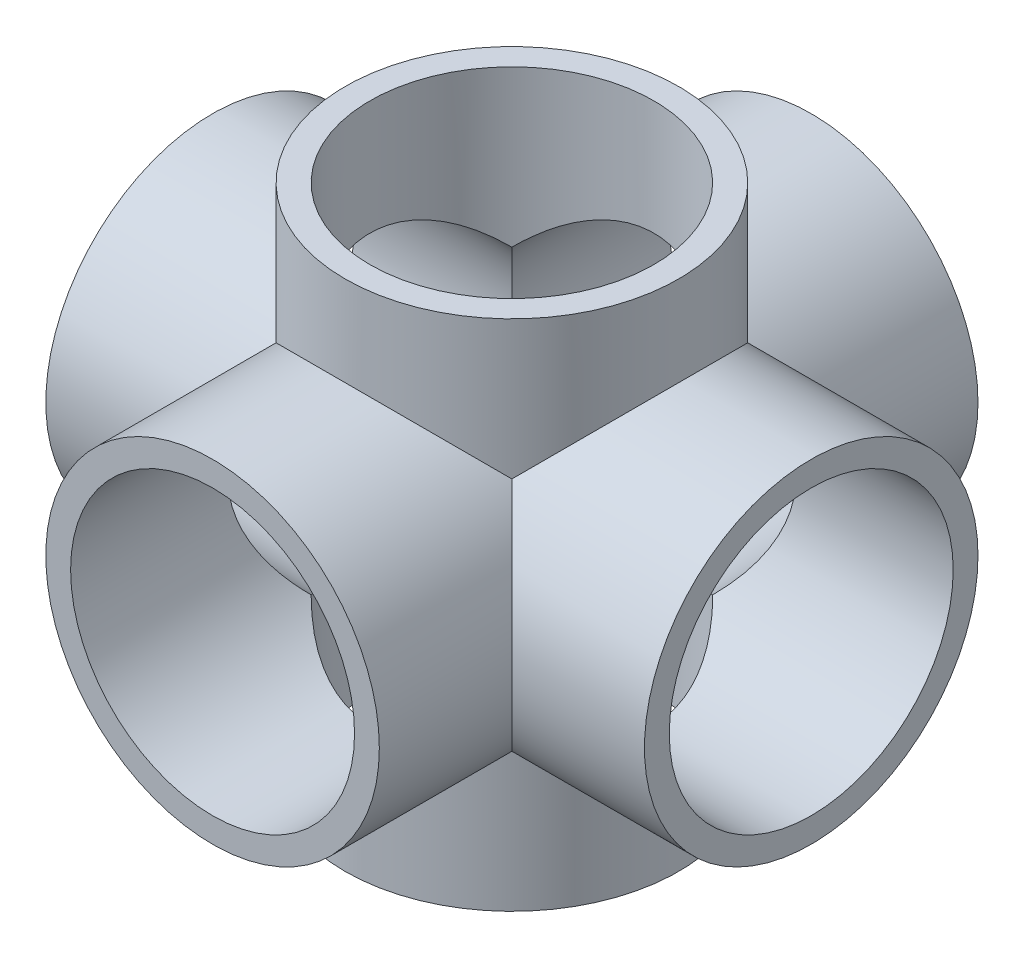
ISO-10303-21;
HEADER;
FILE_DESCRIPTION(('STEP AP214'),'2;1');
FILE_NAME('part.step','',(''),(''),'','','');
FILE_SCHEMA(('AUTOMOTIVE_DESIGN { 1 0 10303 214 1 1 1 1 }'));
ENDSEC;
DATA;
#1=APPLICATION_CONTEXT('core data for automotive mechanical design processes');
#2=APPLICATION_PROTOCOL_DEFINITION('international standard','automotive_design',2000,#1);
#3=PRODUCT_CONTEXT('',#1,'mechanical');
#4=PRODUCT('Part','Part','',(#3));
#5=PRODUCT_RELATED_PRODUCT_CATEGORY('part','',(#4));
#6=PRODUCT_DEFINITION_FORMATION('','',#4);
#7=PRODUCT_DEFINITION_CONTEXT('part definition',#1,'design');
#8=PRODUCT_DEFINITION('design','',#6,#7);
#9=PRODUCT_DEFINITION_SHAPE('','',#8);
#10=(LENGTH_UNIT() NAMED_UNIT(*) SI_UNIT(.MILLI.,.METRE.));
#11=(NAMED_UNIT(*) PLANE_ANGLE_UNIT() SI_UNIT($,.RADIAN.));
#12=(NAMED_UNIT(*) SI_UNIT($,.STERADIAN.) SOLID_ANGLE_UNIT());
#13=UNCERTAINTY_MEASURE_WITH_UNIT(LENGTH_MEASURE(1.E-05),#10,'distance_accuracy_value','');
#14=(GEOMETRIC_REPRESENTATION_CONTEXT(3) GLOBAL_UNCERTAINTY_ASSIGNED_CONTEXT((#13)) GLOBAL_UNIT_ASSIGNED_CONTEXT((#10,
#11,#12)) REPRESENTATION_CONTEXT('',''));
#15=CARTESIAN_POINT('',(0.,0.,0.));
#16=DIRECTION('',(0.,0.,1.));
#17=DIRECTION('',(1.,0.,0.));
#18=AXIS2_PLACEMENT_3D('',#15,#16,#17);
#19=CARTESIAN_POINT('',(-35.,30.,0.));
#20=DIRECTION('',(1.,0.,0.));
#21=DIRECTION('',(0.,0.,-1.));
#22=AXIS2_PLACEMENT_3D('',#19,#20,#21);
#23=CYLINDRICAL_SURFACE('',#22,16.6);
#24=CARTESIAN_POINT('',(-35.,30.,0.));
#25=DIRECTION('',(1.,0.,0.));
#26=DIRECTION('',(0.,0.,-1.));
#27=AXIS2_PLACEMENT_3D('',#24,#25,#26);
#28=CIRCLE('',#27,16.6);
#29=CARTESIAN_POINT('',(-35.,30.,-16.6));
#30=VERTEX_POINT('',#29);
#31=EDGE_CURVE('E210',#30,#30,#28,.T.);
#32=ORIENTED_EDGE('',*,*,#31,.F.);
#33=EDGE_LOOP('',(#32));
#34=FACE_BOUND('',#33,.T.);
#35=CARTESIAN_POINT('',(0.,30.,0.));
#36=DIRECTION('',(0.707106781186547,-0.707106781186547,0.));
#37=DIRECTION('',(0.707106781186547,0.707106781186547,0.));
#38=AXIS2_PLACEMENT_3D('',#35,#36,#37);
#39=ELLIPSE('',#38,23.4759451353934,16.6);
#40=CARTESIAN_POINT('',(-11.7379725676967,18.2620274323033,-11.7379725676967));
#41=VERTEX_POINT('',#40);
#42=CARTESIAN_POINT('',(-11.7379725676967,18.2620274323033,11.7379725676967));
#43=VERTEX_POINT('',#42);
#44=EDGE_CURVE('E243',#41,#43,#39,.F.);
#45=ORIENTED_EDGE('',*,*,#44,.F.);
#46=CARTESIAN_POINT('',(0.,30.,0.));
#47=DIRECTION('',(0.707106781186547,0.,-0.707106781186547));
#48=DIRECTION('',(0.707106781186547,0.,0.707106781186547));
#49=AXIS2_PLACEMENT_3D('',#46,#47,#48);
#50=ELLIPSE('',#49,23.4759451353934,16.6);
#51=CARTESIAN_POINT('',(-11.7379725676967,41.7379725676967,-11.7379725676967));
#52=VERTEX_POINT('',#51);
#53=EDGE_CURVE('E164',#52,#41,#50,.F.);
#54=ORIENTED_EDGE('',*,*,#53,.F.);
#55=CARTESIAN_POINT('',(0.,30.,0.));
#56=DIRECTION('',(0.707106781186547,0.707106781186547,0.));
#57=DIRECTION('',(0.707106781186547,-0.707106781186547,0.));
#58=AXIS2_PLACEMENT_3D('',#55,#56,#57);
#59=ELLIPSE('',#58,23.4759451353934,16.6);
#60=CARTESIAN_POINT('',(-11.7379725676967,41.7379725676967,11.7379725676967));
#61=VERTEX_POINT('',#60);
#62=EDGE_CURVE('E103',#61,#52,#59,.F.);
#63=ORIENTED_EDGE('',*,*,#62,.F.);
#64=CARTESIAN_POINT('',(0.,30.,0.));
#65=DIRECTION('',(0.707106781186547,0.,0.707106781186547));
#66=DIRECTION('',(0.707106781186547,0.,-0.707106781186547));
#67=AXIS2_PLACEMENT_3D('',#64,#65,#66);
#68=ELLIPSE('',#67,23.4759451353934,16.6);
#69=EDGE_CURVE('E162',#43,#61,#68,.F.);
#70=ORIENTED_EDGE('',*,*,#69,.F.);
#71=EDGE_LOOP('',(#45,#54,#63,#70));
#72=FACE_BOUND('',#71,.T.);
#73=ADVANCED_FACE('F80',(#34,#72),#23,.F.);
#74=CARTESIAN_POINT('',(35.,30.,0.));
#75=DIRECTION('',(1.,0.,0.));
#76=DIRECTION('',(0.,0.,-1.));
#77=AXIS2_PLACEMENT_3D('',#74,#75,#76);
#78=CIRCLE('',#77,16.6);
#79=CARTESIAN_POINT('',(35.,30.,-16.6));
#80=VERTEX_POINT('',#79);
#81=EDGE_CURVE('E204',#80,#80,#78,.T.);
#82=ORIENTED_EDGE('',*,*,#81,.T.);
#83=EDGE_LOOP('',(#82));
#84=FACE_BOUND('',#83,.T.);
#85=CARTESIAN_POINT('',(0.,30.,0.));
#86=DIRECTION('',(0.707106781186547,-0.707106781186547,0.));
#87=DIRECTION('',(0.707106781186547,0.707106781186547,0.));
#88=AXIS2_PLACEMENT_3D('',#85,#86,#87);
#89=ELLIPSE('',#88,23.4759451353934,16.6);
#90=CARTESIAN_POINT('',(11.7379725676967,41.7379725676967,-11.7379725676967));
#91=VERTEX_POINT('',#90);
#92=CARTESIAN_POINT('',(11.7379725676967,41.7379725676967,11.7379725676967));
#93=VERTEX_POINT('',#92);
#94=EDGE_CURVE('E145',#91,#93,#89,.T.);
#95=ORIENTED_EDGE('',*,*,#94,.F.);
#96=CARTESIAN_POINT('',(0.,30.,0.));
#97=DIRECTION('',(0.707106781186547,0.,0.707106781186547));
#98=DIRECTION('',(0.707106781186547,0.,-0.707106781186547));
#99=AXIS2_PLACEMENT_3D('',#96,#97,#98);
#100=ELLIPSE('',#99,23.4759451353934,16.6);
#101=CARTESIAN_POINT('',(11.7379725676967,18.2620274323033,-11.7379725676967));
#102=VERTEX_POINT('',#101);
#103=EDGE_CURVE('E156',#102,#91,#100,.T.);
#104=ORIENTED_EDGE('',*,*,#103,.F.);
#105=CARTESIAN_POINT('',(0.,30.,0.));
#106=DIRECTION('',(0.707106781186547,0.707106781186547,0.));
#107=DIRECTION('',(0.707106781186547,-0.707106781186547,0.));
#108=AXIS2_PLACEMENT_3D('',#105,#106,#107);
#109=ELLIPSE('',#108,23.4759451353934,16.6);
#110=CARTESIAN_POINT('',(11.7379725676967,18.2620274323033,11.7379725676967));
#111=VERTEX_POINT('',#110);
#112=EDGE_CURVE('E95',#111,#102,#109,.T.);
#113=ORIENTED_EDGE('',*,*,#112,.F.);
#114=CARTESIAN_POINT('',(0.,30.,0.));
#115=DIRECTION('',(0.707106781186547,0.,-0.707106781186547));
#116=DIRECTION('',(0.707106781186547,0.,0.707106781186547));
#117=AXIS2_PLACEMENT_3D('',#114,#115,#116);
#118=ELLIPSE('',#117,23.4759451353934,16.6);
#119=EDGE_CURVE('E158',#93,#111,#118,.T.);
#120=ORIENTED_EDGE('',*,*,#119,.F.);
#121=EDGE_LOOP('',(#95,#104,#113,#120));
#122=FACE_BOUND('',#121,.T.);
#123=ADVANCED_FACE('F155',(#84,#122),#23,.F.);
#124=CARTESIAN_POINT('',(0.,30.,-35.));
#125=DIRECTION('',(0.,0.,1.));
#126=DIRECTION('',(1.,0.,0.));
#127=AXIS2_PLACEMENT_3D('',#124,#125,#126);
#128=CYLINDRICAL_SURFACE('',#127,16.6);
#129=CARTESIAN_POINT('',(0.,30.,35.));
#130=DIRECTION('',(0.,0.,1.));
#131=DIRECTION('',(1.,0.,0.));
#132=AXIS2_PLACEMENT_3D('',#129,#130,#131);
#133=CIRCLE('',#132,16.6);
#134=CARTESIAN_POINT('',(16.6,30.,35.));
#135=VERTEX_POINT('',#134);
#136=EDGE_CURVE('E172',#135,#135,#133,.T.);
#137=ORIENTED_EDGE('',*,*,#136,.T.);
#138=EDGE_LOOP('',(#137));
#139=FACE_BOUND('',#138,.T.);
#140=CARTESIAN_POINT('',(0.,30.,0.));
#141=DIRECTION('',(0.,-0.707106781186547,0.707106781186547));
#142=DIRECTION('',(0.,0.707106781186547,0.707106781186547));
#143=AXIS2_PLACEMENT_3D('',#140,#141,#142);
#144=ELLIPSE('',#143,23.4759451353934,16.6);
#145=EDGE_CURVE('E248',#93,#61,#144,.T.);
#146=ORIENTED_EDGE('',*,*,#145,.F.);
#147=ORIENTED_EDGE('',*,*,#119,.T.);
#148=CARTESIAN_POINT('',(0.,30.,0.));
#149=DIRECTION('',(0.,0.707106781186547,0.707106781186547));
#150=DIRECTION('',(0.,-0.707106781186547,0.707106781186547));
#151=AXIS2_PLACEMENT_3D('',#148,#149,#150);
#152=ELLIPSE('',#151,23.4759451353934,16.6);
#153=EDGE_CURVE('E167',#43,#111,#152,.T.);
#154=ORIENTED_EDGE('',*,*,#153,.F.);
#155=ORIENTED_EDGE('',*,*,#69,.T.);
#156=EDGE_LOOP('',(#146,#147,#154,#155));
#157=FACE_BOUND('',#156,.T.);
#158=ADVANCED_FACE('F247',(#139,#157),#128,.F.);
#159=CARTESIAN_POINT('',(0.,30.,-35.));
#160=DIRECTION('',(0.,0.,1.));
#161=DIRECTION('',(1.,0.,0.));
#162=AXIS2_PLACEMENT_3D('',#159,#160,#161);
#163=CIRCLE('',#162,16.6);
#164=CARTESIAN_POINT('',(16.6,30.,-35.));
#165=VERTEX_POINT('',#164);
#166=EDGE_CURVE('E178',#165,#165,#163,.T.);
#167=ORIENTED_EDGE('',*,*,#166,.F.);
#168=EDGE_LOOP('',(#167));
#169=FACE_BOUND('',#168,.T.);
#170=CARTESIAN_POINT('',(0.,30.,0.));
#171=DIRECTION('',(0.,-0.707106781186547,0.707106781186547));
#172=DIRECTION('',(0.,0.707106781186547,0.707106781186547));
#173=AXIS2_PLACEMENT_3D('',#170,#171,#172);
#174=ELLIPSE('',#173,23.4759451353934,16.6);
#175=EDGE_CURVE('E161',#102,#41,#174,.F.);
#176=ORIENTED_EDGE('',*,*,#175,.F.);
#177=ORIENTED_EDGE('',*,*,#103,.T.);
#178=CARTESIAN_POINT('',(0.,30.,0.));
#179=DIRECTION('',(0.,0.707106781186547,0.707106781186547));
#180=DIRECTION('',(0.,-0.707106781186547,0.707106781186547));
#181=AXIS2_PLACEMENT_3D('',#178,#179,#180);
#182=ELLIPSE('',#181,23.4759451353934,16.6);
#183=EDGE_CURVE('E142',#52,#91,#182,.F.);
#184=ORIENTED_EDGE('',*,*,#183,.F.);
#185=ORIENTED_EDGE('',*,*,#53,.T.);
#186=EDGE_LOOP('',(#176,#177,#184,#185));
#187=FACE_BOUND('',#186,.T.);
#188=ADVANCED_FACE('F160',(#169,#187),#128,.F.);
#189=CARTESIAN_POINT('',(0.,60.,0.));
#190=DIRECTION('',(0.,-1.,0.));
#191=DIRECTION('',(0.,0.,-1.));
#192=AXIS2_PLACEMENT_3D('',#189,#190,#191);
#193=CYLINDRICAL_SURFACE('',#192,19.5);
#194=CARTESIAN_POINT('',(0.,60.,0.));
#195=DIRECTION('',(0.,1.,0.));
#196=DIRECTION('',(0.,0.,1.));
#197=AXIS2_PLACEMENT_3D('',#194,#195,#196);
#198=CIRCLE('',#197,19.5);
#199=CARTESIAN_POINT('',(0.,60.,19.5));
#200=VERTEX_POINT('',#199);
#201=EDGE_CURVE('E12',#200,#200,#198,.T.);
#202=ORIENTED_EDGE('',*,*,#201,.F.);
#203=EDGE_LOOP('',(#202));
#204=FACE_BOUND('',#203,.T.);
#205=CARTESIAN_POINT('',(0.,30.,0.));
#206=DIRECTION('',(-0.707106781186547,-0.707106781186547,0.));
#207=DIRECTION('',(0.707106781186547,-0.707106781186547,0.));
#208=AXIS2_PLACEMENT_3D('',#205,#206,#207);
#209=ELLIPSE('',#208,27.5771644662754,19.5);
#210=CARTESIAN_POINT('',(-13.7885822331377,43.7885822331377,-13.7885822331377));
#211=VERTEX_POINT('',#210);
#212=CARTESIAN_POINT('',(-13.7885822331377,43.7885822331377,13.7885822331377));
#213=VERTEX_POINT('',#212);
#214=EDGE_CURVE('E216',#211,#213,#209,.F.);
#215=ORIENTED_EDGE('',*,*,#214,.T.);
#216=CARTESIAN_POINT('',(0.,30.,0.));
#217=DIRECTION('',(0.,-0.707106781186547,0.707106781186547));
#218=DIRECTION('',(0.,-0.707106781186547,-0.707106781186547));
#219=AXIS2_PLACEMENT_3D('',#216,#217,#218);
#220=ELLIPSE('',#219,27.5771644662754,19.5);
#221=CARTESIAN_POINT('',(13.7885822331377,43.7885822331377,13.7885822331377));
#222=VERTEX_POINT('',#221);
#223=EDGE_CURVE('E191',#213,#222,#220,.F.);
#224=ORIENTED_EDGE('',*,*,#223,.T.);
#225=CARTESIAN_POINT('',(0.,30.,0.));
#226=DIRECTION('',(0.707106781186547,-0.707106781186547,0.));
#227=DIRECTION('',(-0.707106781186547,-0.707106781186547,0.));
#228=AXIS2_PLACEMENT_3D('',#225,#226,#227);
#229=ELLIPSE('',#228,27.5771644662754,19.5);
#230=CARTESIAN_POINT('',(13.7885822331377,43.7885822331377,-13.7885822331377));
#231=VERTEX_POINT('',#230);
#232=EDGE_CURVE('E225',#222,#231,#229,.F.);
#233=ORIENTED_EDGE('',*,*,#232,.T.);
#234=CARTESIAN_POINT('',(0.,30.,0.));
#235=DIRECTION('',(0.,-0.707106781186547,-0.707106781186547));
#236=DIRECTION('',(0.,-0.707106781186547,0.707106781186547));
#237=AXIS2_PLACEMENT_3D('',#234,#235,#236);
#238=ELLIPSE('',#237,27.5771644662754,19.5);
#239=EDGE_CURVE('E201',#231,#211,#238,.F.);
#240=ORIENTED_EDGE('',*,*,#239,.T.);
#241=EDGE_LOOP('',(#215,#224,#233,#240));
#242=FACE_BOUND('',#241,.T.);
#243=ADVANCED_FACE('F284',(#204,#242),#193,.T.);
#244=CARTESIAN_POINT('',(0.,60.,0.));
#245=DIRECTION('',(0.,-1.,0.));
#246=DIRECTION('',(0.,0.,-1.));
#247=AXIS2_PLACEMENT_3D('',#244,#245,#246);
#248=CYLINDRICAL_SURFACE('',#247,16.6);
#249=CARTESIAN_POINT('',(0.,60.,0.));
#250=DIRECTION('',(0.,1.,0.));
#251=DIRECTION('',(0.,0.,1.));
#252=AXIS2_PLACEMENT_3D('',#249,#250,#251);
#253=CIRCLE('',#252,16.6);
#254=CARTESIAN_POINT('',(0.,60.,16.6));
#255=VERTEX_POINT('',#254);
#256=EDGE_CURVE('E229',#255,#255,#253,.T.);
#257=ORIENTED_EDGE('',*,*,#256,.T.);
#258=EDGE_LOOP('',(#257));
#259=FACE_BOUND('',#258,.T.);
#260=ORIENTED_EDGE('',*,*,#145,.T.);
#261=ORIENTED_EDGE('',*,*,#62,.T.);
#262=ORIENTED_EDGE('',*,*,#183,.T.);
#263=ORIENTED_EDGE('',*,*,#94,.T.);
#264=EDGE_LOOP('',(#260,#261,#262,#263));
#265=FACE_BOUND('',#264,.T.);
#266=ADVANCED_FACE('F144',(#259,#265),#248,.F.);
#267=CARTESIAN_POINT('',(0.,60.,0.));
#268=DIRECTION('',(0.,1.,0.));
#269=DIRECTION('',(0.,0.,1.));
#270=AXIS2_PLACEMENT_3D('',#267,#268,#269);
#271=PLANE('',#270);
#272=ORIENTED_EDGE('',*,*,#201,.T.);
#273=EDGE_LOOP('',(#272));
#274=FACE_BOUND('',#273,.T.);
#275=ORIENTED_EDGE('',*,*,#256,.F.);
#276=EDGE_LOOP('',(#275));
#277=FACE_BOUND('',#276,.T.);
#278=ADVANCED_FACE('F273',(#274,#277),#271,.T.);
#279=CARTESIAN_POINT('',(-35.,30.,0.));
#280=DIRECTION('',(1.,0.,0.));
#281=DIRECTION('',(0.,0.,-1.));
#282=AXIS2_PLACEMENT_3D('',#279,#280,#281);
#283=CYLINDRICAL_SURFACE('',#282,19.5);
#284=CARTESIAN_POINT('',(0.,30.,0.));
#285=DIRECTION('',(0.707106781186547,0.,0.707106781186547));
#286=DIRECTION('',(0.707106781186547,0.,-0.707106781186547));
#287=AXIS2_PLACEMENT_3D('',#284,#285,#286);
#288=ELLIPSE('',#287,27.5771644662754,19.5);
#289=CARTESIAN_POINT('',(13.7885822331377,16.2114177668623,-13.7885822331377));
#290=VERTEX_POINT('',#289);
#291=EDGE_CURVE('E199',#231,#290,#288,.F.);
#292=ORIENTED_EDGE('',*,*,#291,.F.);
#293=ORIENTED_EDGE('',*,*,#232,.F.);
#294=CARTESIAN_POINT('',(0.,30.,0.));
#295=DIRECTION('',(0.707106781186547,0.,-0.707106781186547));
#296=DIRECTION('',(0.707106781186547,0.,0.707106781186547));
#297=AXIS2_PLACEMENT_3D('',#294,#295,#296);
#298=ELLIPSE('',#297,27.5771644662754,19.5);
#299=CARTESIAN_POINT('',(13.7885822331377,16.2114177668623,13.7885822331377));
#300=VERTEX_POINT('',#299);
#301=EDGE_CURVE('E189',#300,#222,#298,.F.);
#302=ORIENTED_EDGE('',*,*,#301,.F.);
#303=CARTESIAN_POINT('',(0.,30.,0.));
#304=DIRECTION('',(-0.707106781186547,-0.707106781186547,0.));
#305=DIRECTION('',(0.707106781186547,-0.707106781186547,0.));
#306=AXIS2_PLACEMENT_3D('',#303,#304,#305);
#307=ELLIPSE('',#306,27.5771644662754,19.5);
#308=EDGE_CURVE('E219',#290,#300,#307,.T.);
#309=ORIENTED_EDGE('',*,*,#308,.F.);
#310=EDGE_LOOP('',(#292,#293,#302,#309));
#311=FACE_BOUND('',#310,.T.);
#312=CARTESIAN_POINT('',(35.,30.,0.));
#313=DIRECTION('',(1.,0.,0.));
#314=DIRECTION('',(0.,0.,-1.));
#315=AXIS2_PLACEMENT_3D('',#312,#313,#314);
#316=CIRCLE('',#315,19.5);
#317=CARTESIAN_POINT('',(35.,30.,-19.5));
#318=VERTEX_POINT('',#317);
#319=EDGE_CURVE('E207',#318,#318,#316,.T.);
#320=ORIENTED_EDGE('',*,*,#319,.F.);
#321=EDGE_LOOP('',(#320));
#322=FACE_BOUND('',#321,.T.);
#323=ADVANCED_FACE('F271',(#311,#322),#283,.T.);
#324=CARTESIAN_POINT('',(35.,30.,0.));
#325=DIRECTION('',(1.,0.,0.));
#326=DIRECTION('',(0.,0.,-1.));
#327=AXIS2_PLACEMENT_3D('',#324,#325,#326);
#328=PLANE('',#327);
#329=ORIENTED_EDGE('',*,*,#319,.T.);
#330=EDGE_LOOP('',(#329));
#331=FACE_BOUND('',#330,.T.);
#332=ORIENTED_EDGE('',*,*,#81,.F.);
#333=EDGE_LOOP('',(#332));
#334=FACE_BOUND('',#333,.T.);
#335=ADVANCED_FACE('F264',(#331,#334),#328,.T.);
#336=CARTESIAN_POINT('',(0.,30.,0.));
#337=DIRECTION('',(0.707106781186547,0.,0.707106781186547));
#338=DIRECTION('',(0.707106781186547,0.,-0.707106781186547));
#339=AXIS2_PLACEMENT_3D('',#336,#337,#338);
#340=ELLIPSE('',#339,27.5771644662754,19.5);
#341=CARTESIAN_POINT('',(-13.7885822331377,16.2114177668623,13.7885822331377));
#342=VERTEX_POINT('',#341);
#343=EDGE_CURVE('E187',#213,#342,#340,.T.);
#344=ORIENTED_EDGE('',*,*,#343,.F.);
#345=ORIENTED_EDGE('',*,*,#214,.F.);
#346=CARTESIAN_POINT('',(0.,30.,0.));
#347=DIRECTION('',(0.707106781186547,0.,-0.707106781186547));
#348=DIRECTION('',(0.707106781186547,0.,0.707106781186547));
#349=AXIS2_PLACEMENT_3D('',#346,#347,#348);
#350=ELLIPSE('',#349,27.5771644662754,19.5);
#351=CARTESIAN_POINT('',(-13.7885822331377,16.2114177668623,-13.7885822331377));
#352=VERTEX_POINT('',#351);
#353=EDGE_CURVE('E197',#352,#211,#350,.T.);
#354=ORIENTED_EDGE('',*,*,#353,.F.);
#355=CARTESIAN_POINT('',(0.,30.,0.));
#356=DIRECTION('',(0.707106781186547,-0.707106781186547,0.));
#357=DIRECTION('',(-0.707106781186547,-0.707106781186547,0.));
#358=AXIS2_PLACEMENT_3D('',#355,#356,#357);
#359=ELLIPSE('',#358,27.5771644662754,19.5);
#360=EDGE_CURVE('E222',#342,#352,#359,.T.);
#361=ORIENTED_EDGE('',*,*,#360,.F.);
#362=EDGE_LOOP('',(#344,#345,#354,#361));
#363=FACE_BOUND('',#362,.T.);
#364=CARTESIAN_POINT('',(-35.,30.,0.));
#365=DIRECTION('',(1.,0.,0.));
#366=DIRECTION('',(0.,0.,-1.));
#367=AXIS2_PLACEMENT_3D('',#364,#365,#366);
#368=CIRCLE('',#367,19.5);
#369=CARTESIAN_POINT('',(-35.,30.,-19.5));
#370=VERTEX_POINT('',#369);
#371=EDGE_CURVE('E213',#370,#370,#368,.T.);
#372=ORIENTED_EDGE('',*,*,#371,.T.);
#373=EDGE_LOOP('',(#372));
#374=FACE_BOUND('',#373,.T.);
#375=ADVANCED_FACE('F269',(#363,#374),#283,.T.);
#376=CARTESIAN_POINT('',(-35.,30.,0.));
#377=DIRECTION('',(1.,0.,0.));
#378=DIRECTION('',(0.,0.,-1.));
#379=AXIS2_PLACEMENT_3D('',#376,#377,#378);
#380=PLANE('',#379);
#381=ORIENTED_EDGE('',*,*,#31,.T.);
#382=EDGE_LOOP('',(#381));
#383=FACE_BOUND('',#382,.T.);
#384=ORIENTED_EDGE('',*,*,#371,.F.);
#385=EDGE_LOOP('',(#384));
#386=FACE_BOUND('',#385,.T.);
#387=ADVANCED_FACE('F266',(#383,#386),#380,.F.);
#388=ORIENTED_EDGE('',*,*,#360,.T.);
#389=CARTESIAN_POINT('',(0.,30.,0.));
#390=DIRECTION('',(0.,-0.707106781186547,0.707106781186547));
#391=DIRECTION('',(0.,-0.707106781186547,-0.707106781186547));
#392=AXIS2_PLACEMENT_3D('',#389,#390,#391);
#393=ELLIPSE('',#392,27.5771644662754,19.5);
#394=EDGE_CURVE('E194',#352,#290,#393,.T.);
#395=ORIENTED_EDGE('',*,*,#394,.T.);
#396=ORIENTED_EDGE('',*,*,#308,.T.);
#397=CARTESIAN_POINT('',(0.,30.,0.));
#398=DIRECTION('',(0.,-0.707106781186547,-0.707106781186547));
#399=DIRECTION('',(0.,-0.707106781186547,0.707106781186547));
#400=AXIS2_PLACEMENT_3D('',#397,#398,#399);
#401=ELLIPSE('',#400,27.5771644662754,19.5);
#402=EDGE_CURVE('E184',#300,#342,#401,.T.);
#403=ORIENTED_EDGE('',*,*,#402,.T.);
#404=EDGE_LOOP('',(#388,#395,#396,#403));
#405=FACE_BOUND('',#404,.T.);
#406=CARTESIAN_POINT('',(0.,0.,0.));
#407=DIRECTION('',(0.,1.,0.));
#408=DIRECTION('',(0.,0.,1.));
#409=AXIS2_PLACEMENT_3D('',#406,#407,#408);
#410=CIRCLE('',#409,19.5);
#411=CARTESIAN_POINT('',(0.,0.,19.5));
#412=VERTEX_POINT('',#411);
#413=EDGE_CURVE('E84',#412,#412,#410,.T.);
#414=ORIENTED_EDGE('',*,*,#413,.T.);
#415=EDGE_LOOP('',(#414));
#416=FACE_BOUND('',#415,.T.);
#417=ADVANCED_FACE('F82',(#405,#416),#193,.T.);
#418=CARTESIAN_POINT('',(0.,0.,0.));
#419=DIRECTION('',(0.,1.,0.));
#420=DIRECTION('',(0.,0.,1.));
#421=AXIS2_PLACEMENT_3D('',#418,#419,#420);
#422=PLANE('',#421);
#423=ORIENTED_EDGE('',*,*,#413,.F.);
#424=EDGE_LOOP('',(#423));
#425=FACE_BOUND('',#424,.T.);
#426=CARTESIAN_POINT('',(0.,0.,0.));
#427=DIRECTION('',(0.,1.,0.));
#428=DIRECTION('',(0.,0.,1.));
#429=AXIS2_PLACEMENT_3D('',#426,#427,#428);
#430=CIRCLE('',#429,16.6);
#431=CARTESIAN_POINT('',(0.,0.,16.6));
#432=VERTEX_POINT('',#431);
#433=EDGE_CURVE('E228',#432,#432,#430,.T.);
#434=ORIENTED_EDGE('',*,*,#433,.T.);
#435=EDGE_LOOP('',(#434));
#436=FACE_BOUND('',#435,.T.);
#437=ADVANCED_FACE('F235',(#425,#436),#422,.F.);
#438=ORIENTED_EDGE('',*,*,#433,.F.);
#439=EDGE_LOOP('',(#438));
#440=FACE_BOUND('',#439,.T.);
#441=ORIENTED_EDGE('',*,*,#153,.T.);
#442=ORIENTED_EDGE('',*,*,#112,.T.);
#443=ORIENTED_EDGE('',*,*,#175,.T.);
#444=ORIENTED_EDGE('',*,*,#44,.T.);
#445=EDGE_LOOP('',(#441,#442,#443,#444));
#446=FACE_BOUND('',#445,.T.);
#447=ADVANCED_FACE('F237',(#440,#446),#248,.F.);
#448=CARTESIAN_POINT('',(0.,30.,-35.));
#449=DIRECTION('',(0.,0.,1.));
#450=DIRECTION('',(1.,0.,0.));
#451=AXIS2_PLACEMENT_3D('',#448,#449,#450);
#452=CYLINDRICAL_SURFACE('',#451,19.5);
#453=CARTESIAN_POINT('',(0.,30.,35.));
#454=DIRECTION('',(0.,0.,1.));
#455=DIRECTION('',(1.,0.,0.));
#456=AXIS2_PLACEMENT_3D('',#453,#454,#455);
#457=CIRCLE('',#456,19.5);
#458=CARTESIAN_POINT('',(19.5,30.,35.));
#459=VERTEX_POINT('',#458);
#460=EDGE_CURVE('E175',#459,#459,#457,.T.);
#461=ORIENTED_EDGE('',*,*,#460,.F.);
#462=EDGE_LOOP('',(#461));
#463=FACE_BOUND('',#462,.T.);
#464=ORIENTED_EDGE('',*,*,#223,.F.);
#465=ORIENTED_EDGE('',*,*,#343,.T.);
#466=ORIENTED_EDGE('',*,*,#402,.F.);
#467=ORIENTED_EDGE('',*,*,#301,.T.);
#468=EDGE_LOOP('',(#464,#465,#466,#467));
#469=FACE_BOUND('',#468,.T.);
#470=ADVANCED_FACE('F239',(#463,#469),#452,.T.);
#471=CARTESIAN_POINT('',(0.,30.,35.));
#472=DIRECTION('',(0.,0.,1.));
#473=DIRECTION('',(1.,0.,0.));
#474=AXIS2_PLACEMENT_3D('',#471,#472,#473);
#475=PLANE('',#474);
#476=ORIENTED_EDGE('',*,*,#460,.T.);
#477=EDGE_LOOP('',(#476));
#478=FACE_BOUND('',#477,.T.);
#479=ORIENTED_EDGE('',*,*,#136,.F.);
#480=EDGE_LOOP('',(#479));
#481=FACE_BOUND('',#480,.T.);
#482=ADVANCED_FACE('F321',(#478,#481),#475,.T.);
#483=CARTESIAN_POINT('',(0.,30.,-35.));
#484=DIRECTION('',(0.,0.,1.));
#485=DIRECTION('',(1.,0.,0.));
#486=AXIS2_PLACEMENT_3D('',#483,#484,#485);
#487=PLANE('',#486);
#488=ORIENTED_EDGE('',*,*,#166,.T.);
#489=EDGE_LOOP('',(#488));
#490=FACE_BOUND('',#489,.T.);
#491=CARTESIAN_POINT('',(0.,30.,-35.));
#492=DIRECTION('',(0.,0.,1.));
#493=DIRECTION('',(1.,0.,0.));
#494=AXIS2_PLACEMENT_3D('',#491,#492,#493);
#495=CIRCLE('',#494,19.5);
#496=CARTESIAN_POINT('',(19.5,30.,-35.));
#497=VERTEX_POINT('',#496);
#498=EDGE_CURVE('E181',#497,#497,#495,.T.);
#499=ORIENTED_EDGE('',*,*,#498,.F.);
#500=EDGE_LOOP('',(#499));
#501=FACE_BOUND('',#500,.T.);
#502=ADVANCED_FACE('F316',(#490,#501),#487,.F.);
#503=ORIENTED_EDGE('',*,*,#498,.T.);
#504=EDGE_LOOP('',(#503));
#505=FACE_BOUND('',#504,.T.);
#506=ORIENTED_EDGE('',*,*,#239,.F.);
#507=ORIENTED_EDGE('',*,*,#291,.T.);
#508=ORIENTED_EDGE('',*,*,#394,.F.);
#509=ORIENTED_EDGE('',*,*,#353,.T.);
#510=EDGE_LOOP('',(#506,#507,#508,#509));
#511=FACE_BOUND('',#510,.T.);
#512=ADVANCED_FACE('F314',(#505,#511),#452,.T.);
#513=CLOSED_SHELL('',(#73,#123,#158,#188,#243,#266,#278,#323,#335,#375,#387,#417,#437,#447,#470,
#482,#502,#512));
#514=MANIFOLD_SOLID_BREP('B2',#513);
#515=ADVANCED_BREP_SHAPE_REPRESENTATION('',(#18,#514),#14);
#516=SHAPE_DEFINITION_REPRESENTATION(#9,#515);
ENDSEC;
END-ISO-10303-21;
